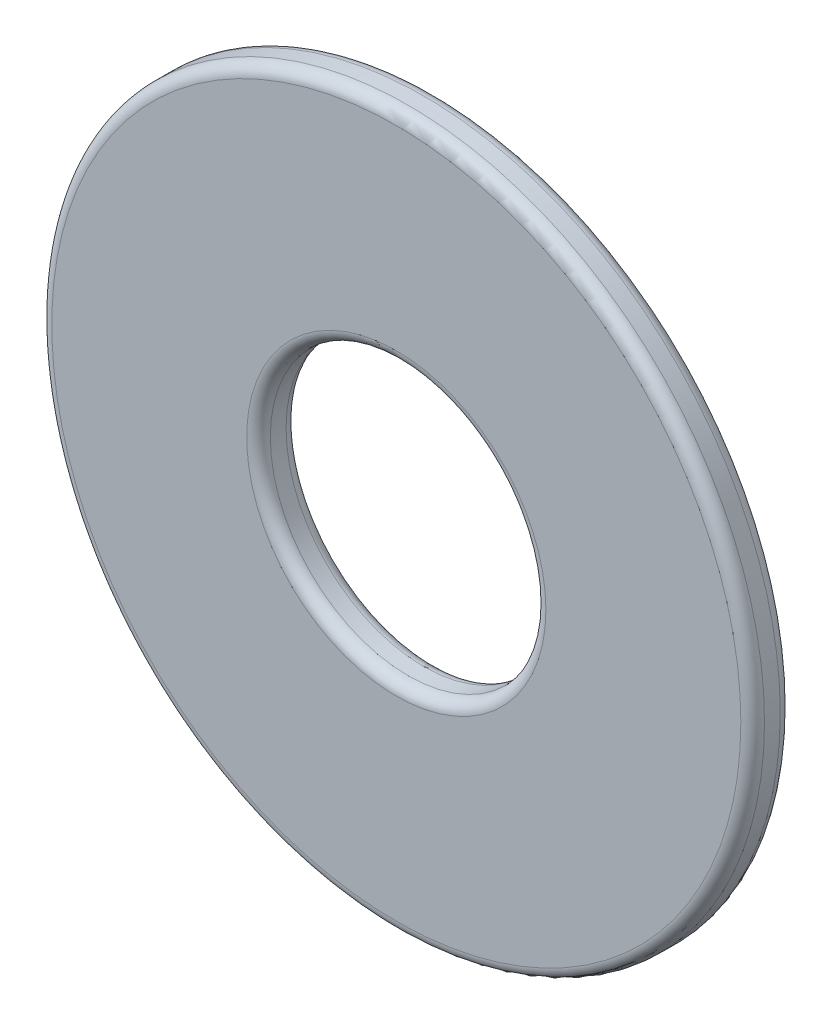
ISO-10303-21;
HEADER;
FILE_DESCRIPTION(('STEP AP214'),'2;1');
FILE_NAME('part.step','',(''),(''),'','','');
FILE_SCHEMA(('AUTOMOTIVE_DESIGN { 1 0 10303 214 1 1 1 1 }'));
ENDSEC;
DATA;
#1=APPLICATION_CONTEXT('core data for automotive mechanical design processes');
#2=APPLICATION_PROTOCOL_DEFINITION('international standard','automotive_design',2000,#1);
#3=PRODUCT_CONTEXT('',#1,'mechanical');
#4=PRODUCT('Part','Part','',(#3));
#5=PRODUCT_RELATED_PRODUCT_CATEGORY('part','',(#4));
#6=PRODUCT_DEFINITION_FORMATION('','',#4);
#7=PRODUCT_DEFINITION_CONTEXT('part definition',#1,'design');
#8=PRODUCT_DEFINITION('design','',#6,#7);
#9=PRODUCT_DEFINITION_SHAPE('','',#8);
#10=(LENGTH_UNIT() NAMED_UNIT(*) SI_UNIT(.MILLI.,.METRE.));
#11=(NAMED_UNIT(*) PLANE_ANGLE_UNIT() SI_UNIT($,.RADIAN.));
#12=(NAMED_UNIT(*) SI_UNIT($,.STERADIAN.) SOLID_ANGLE_UNIT());
#13=UNCERTAINTY_MEASURE_WITH_UNIT(LENGTH_MEASURE(1.E-05),#10,'distance_accuracy_value','');
#14=(GEOMETRIC_REPRESENTATION_CONTEXT(3) GLOBAL_UNCERTAINTY_ASSIGNED_CONTEXT((#13)) GLOBAL_UNIT_ASSIGNED_CONTEXT((#10,
#11,#12)) REPRESENTATION_CONTEXT('',''));
#15=CARTESIAN_POINT('',(0.,0.,0.));
#16=DIRECTION('',(0.,0.,1.));
#17=DIRECTION('',(1.,0.,0.));
#18=AXIS2_PLACEMENT_3D('',#15,#16,#17);
#19=CARTESIAN_POINT('',(0.,0.,1.));
#20=DIRECTION('',(0.,0.,1.));
#21=DIRECTION('',(1.,0.,0.));
#22=AXIS2_PLACEMENT_3D('',#19,#20,#21);
#23=PLANE('',#22);
#24=CARTESIAN_POINT('',(0.,0.,1.));
#25=DIRECTION('',(0.,0.,1.));
#26=DIRECTION('',(1.,0.,0.));
#27=AXIS2_PLACEMENT_3D('',#24,#25,#26);
#28=CIRCLE('',#27,3.8);
#29=CARTESIAN_POINT('',(3.8,0.,1.));
#30=VERTEX_POINT('',#29);
#31=EDGE_CURVE('E10',#30,#30,#28,.F.);
#32=ORIENTED_EDGE('',*,*,#31,.T.);
#33=EDGE_LOOP('',(#32));
#34=FACE_BOUND('',#33,.T.);
#35=CARTESIAN_POINT('',(0.,0.,1.));
#36=DIRECTION('',(0.,0.,1.));
#37=DIRECTION('',(1.,0.,0.));
#38=AXIS2_PLACEMENT_3D('',#35,#36,#37);
#39=CIRCLE('',#38,8.75);
#40=CARTESIAN_POINT('',(8.75,0.,1.));
#41=VERTEX_POINT('',#40);
#42=EDGE_CURVE('E48',#41,#41,#39,.T.);
#43=ORIENTED_EDGE('',*,*,#42,.T.);
#44=EDGE_LOOP('',(#43));
#45=FACE_BOUND('',#44,.T.);
#46=ADVANCED_FACE('F41',(#34,#45),#23,.T.);
#47=CARTESIAN_POINT('',(0.,0.,0.));
#48=DIRECTION('',(0.,0.,1.));
#49=DIRECTION('',(1.,0.,0.));
#50=AXIS2_PLACEMENT_3D('',#47,#48,#49);
#51=PLANE('',#50);
#52=CARTESIAN_POINT('',(0.,0.,0.));
#53=DIRECTION('',(0.,0.,1.));
#54=DIRECTION('',(1.,0.,0.));
#55=AXIS2_PLACEMENT_3D('',#52,#53,#54);
#56=CIRCLE('',#55,3.8);
#57=CARTESIAN_POINT('',(3.8,0.,0.));
#58=VERTEX_POINT('',#57);
#59=EDGE_CURVE('E67',#58,#58,#56,.T.);
#60=ORIENTED_EDGE('',*,*,#59,.T.);
#61=EDGE_LOOP('',(#60));
#62=FACE_BOUND('',#61,.T.);
#63=CARTESIAN_POINT('',(0.,0.,0.));
#64=DIRECTION('',(0.,0.,1.));
#65=DIRECTION('',(1.,0.,0.));
#66=AXIS2_PLACEMENT_3D('',#63,#64,#65);
#67=CIRCLE('',#66,8.75);
#68=CARTESIAN_POINT('',(8.75,0.,0.));
#69=VERTEX_POINT('',#68);
#70=EDGE_CURVE('E70',#69,#69,#67,.F.);
#71=ORIENTED_EDGE('',*,*,#70,.T.);
#72=EDGE_LOOP('',(#71));
#73=FACE_BOUND('',#72,.T.);
#74=ADVANCED_FACE('F74',(#62,#73),#51,.F.);
#75=CARTESIAN_POINT('',(0.,0.,1.));
#76=DIRECTION('',(0.,0.,-1.));
#77=DIRECTION('',(-1.,0.,0.));
#78=AXIS2_PLACEMENT_3D('',#75,#76,#77);
#79=CYLINDRICAL_SURFACE('',#78,9.05);
#80=CARTESIAN_POINT('',(0.,0.,0.3));
#81=DIRECTION('',(0.,0.,1.));
#82=DIRECTION('',(1.,0.,0.));
#83=AXIS2_PLACEMENT_3D('',#80,#81,#82);
#84=CIRCLE('',#83,9.05);
#85=CARTESIAN_POINT('',(9.05,0.,0.3));
#86=VERTEX_POINT('',#85);
#87=EDGE_CURVE('E52',#86,#86,#84,.T.);
#88=ORIENTED_EDGE('',*,*,#87,.T.);
#89=EDGE_LOOP('',(#88));
#90=FACE_BOUND('',#89,.T.);
#91=CARTESIAN_POINT('',(0.,0.,0.7));
#92=DIRECTION('',(0.,0.,1.));
#93=DIRECTION('',(1.,0.,0.));
#94=AXIS2_PLACEMENT_3D('',#91,#92,#93);
#95=CIRCLE('',#94,9.05);
#96=CARTESIAN_POINT('',(9.05,0.,0.7));
#97=VERTEX_POINT('',#96);
#98=EDGE_CURVE('E56',#97,#97,#95,.F.);
#99=ORIENTED_EDGE('',*,*,#98,.T.);
#100=EDGE_LOOP('',(#99));
#101=FACE_BOUND('',#100,.T.);
#102=ADVANCED_FACE('F84',(#90,#101),#79,.T.);
#103=CARTESIAN_POINT('',(0.,0.,1.));
#104=DIRECTION('',(0.,0.,-1.));
#105=DIRECTION('',(-1.,0.,0.));
#106=AXIS2_PLACEMENT_3D('',#103,#104,#105);
#107=CYLINDRICAL_SURFACE('',#106,3.5);
#108=CARTESIAN_POINT('',(0.,0.,0.3));
#109=DIRECTION('',(0.,0.,1.));
#110=DIRECTION('',(1.,0.,0.));
#111=AXIS2_PLACEMENT_3D('',#108,#109,#110);
#112=CIRCLE('',#111,3.5);
#113=CARTESIAN_POINT('',(3.5,0.,0.3));
#114=VERTEX_POINT('',#113);
#115=EDGE_CURVE('E61',#114,#114,#112,.F.);
#116=ORIENTED_EDGE('',*,*,#115,.T.);
#117=EDGE_LOOP('',(#116));
#118=FACE_BOUND('',#117,.T.);
#119=CARTESIAN_POINT('',(0.,0.,0.7));
#120=DIRECTION('',(0.,0.,1.));
#121=DIRECTION('',(1.,0.,0.));
#122=AXIS2_PLACEMENT_3D('',#119,#120,#121);
#123=CIRCLE('',#122,3.5);
#124=CARTESIAN_POINT('',(3.5,0.,0.7));
#125=VERTEX_POINT('',#124);
#126=EDGE_CURVE('E64',#125,#125,#123,.T.);
#127=ORIENTED_EDGE('',*,*,#126,.T.);
#128=EDGE_LOOP('',(#127));
#129=FACE_BOUND('',#128,.T.);
#130=ADVANCED_FACE('F87',(#118,#129),#107,.F.);
#131=CARTESIAN_POINT('',(0.,0.,0.3));
#132=DIRECTION('',(0.,0.,1.));
#133=DIRECTION('',(1.,0.,0.));
#134=AXIS2_PLACEMENT_3D('',#131,#132,#133);
#135=TOROIDAL_SURFACE('',#134,3.8,0.3);
#136=ORIENTED_EDGE('',*,*,#115,.F.);
#137=EDGE_LOOP('',(#136));
#138=FACE_BOUND('',#137,.T.);
#139=ORIENTED_EDGE('',*,*,#59,.F.);
#140=EDGE_LOOP('',(#139));
#141=FACE_BOUND('',#140,.T.);
#142=ADVANCED_FACE('F80',(#138,#141),#135,.T.);
#143=CARTESIAN_POINT('',(0.,0.,0.3));
#144=DIRECTION('',(0.,0.,1.));
#145=DIRECTION('',(1.,0.,0.));
#146=AXIS2_PLACEMENT_3D('',#143,#144,#145);
#147=TOROIDAL_SURFACE('',#146,8.75,0.3);
#148=ORIENTED_EDGE('',*,*,#70,.F.);
#149=EDGE_LOOP('',(#148));
#150=FACE_BOUND('',#149,.T.);
#151=ORIENTED_EDGE('',*,*,#87,.F.);
#152=EDGE_LOOP('',(#151));
#153=FACE_BOUND('',#152,.T.);
#154=ADVANCED_FACE('F76',(#150,#153),#147,.T.);
#155=CARTESIAN_POINT('',(0.,0.,0.7));
#156=DIRECTION('',(0.,0.,1.));
#157=DIRECTION('',(1.,0.,0.));
#158=AXIS2_PLACEMENT_3D('',#155,#156,#157);
#159=TOROIDAL_SURFACE('',#158,3.8,0.3);
#160=ORIENTED_EDGE('',*,*,#31,.F.);
#161=EDGE_LOOP('',(#160));
#162=FACE_BOUND('',#161,.T.);
#163=ORIENTED_EDGE('',*,*,#126,.F.);
#164=EDGE_LOOP('',(#163));
#165=FACE_BOUND('',#164,.T.);
#166=ADVANCED_FACE('F79',(#162,#165),#159,.T.);
#167=CARTESIAN_POINT('',(0.,0.,0.7));
#168=DIRECTION('',(0.,0.,1.));
#169=DIRECTION('',(1.,0.,0.));
#170=AXIS2_PLACEMENT_3D('',#167,#168,#169);
#171=TOROIDAL_SURFACE('',#170,8.75,0.3);
#172=ORIENTED_EDGE('',*,*,#98,.F.);
#173=EDGE_LOOP('',(#172));
#174=FACE_BOUND('',#173,.T.);
#175=ORIENTED_EDGE('',*,*,#42,.F.);
#176=EDGE_LOOP('',(#175));
#177=FACE_BOUND('',#176,.T.);
#178=ADVANCED_FACE('F43',(#174,#177),#171,.T.);
#179=CLOSED_SHELL('',(#46,#74,#102,#130,#142,#154,#166,#178));
#180=MANIFOLD_SOLID_BREP('B2',#179);
#181=ADVANCED_BREP_SHAPE_REPRESENTATION('',(#18,#180),#14);
#182=SHAPE_DEFINITION_REPRESENTATION(#9,#181);
ENDSEC;
END-ISO-10303-21;
